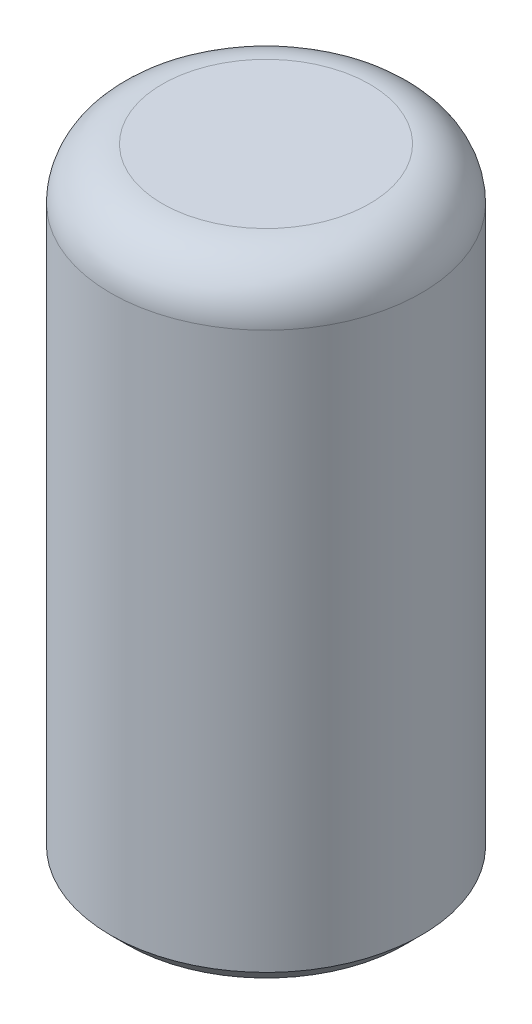
ISO-10303-21;
HEADER;
FILE_DESCRIPTION(('STEP AP214'),'2;1');
FILE_NAME('part.step','',(''),(''),'','','');
FILE_SCHEMA(('AUTOMOTIVE_DESIGN { 1 0 10303 214 1 1 1 1 }'));
ENDSEC;
DATA;
#1=APPLICATION_CONTEXT('core data for automotive mechanical design processes');
#2=APPLICATION_PROTOCOL_DEFINITION('international standard','automotive_design',2000,#1);
#3=PRODUCT_CONTEXT('',#1,'mechanical');
#4=PRODUCT('Part','Part','',(#3));
#5=PRODUCT_RELATED_PRODUCT_CATEGORY('part','',(#4));
#6=PRODUCT_DEFINITION_FORMATION('','',#4);
#7=PRODUCT_DEFINITION_CONTEXT('part definition',#1,'design');
#8=PRODUCT_DEFINITION('design','',#6,#7);
#9=PRODUCT_DEFINITION_SHAPE('','',#8);
#10=(LENGTH_UNIT() NAMED_UNIT(*) SI_UNIT(.MILLI.,.METRE.));
#11=(NAMED_UNIT(*) PLANE_ANGLE_UNIT() SI_UNIT($,.RADIAN.));
#12=(NAMED_UNIT(*) SI_UNIT($,.STERADIAN.) SOLID_ANGLE_UNIT());
#13=UNCERTAINTY_MEASURE_WITH_UNIT(LENGTH_MEASURE(1.E-05),#10,'distance_accuracy_value','');
#14=(GEOMETRIC_REPRESENTATION_CONTEXT(3) GLOBAL_UNCERTAINTY_ASSIGNED_CONTEXT((#13)) GLOBAL_UNIT_ASSIGNED_CONTEXT((#10,
#11,#12)) REPRESENTATION_CONTEXT('',''));
#15=CARTESIAN_POINT('',(0.,0.,0.));
#16=DIRECTION('',(0.,0.,1.));
#17=DIRECTION('',(1.,0.,0.));
#18=AXIS2_PLACEMENT_3D('',#15,#16,#17);
#19=CARTESIAN_POINT('',(0.,0.,0.));
#20=DIRECTION('',(0.,1.,0.));
#21=DIRECTION('',(0.,0.,0.999999999999998));
#22=AXIS2_PLACEMENT_3D('',#19,#20,#21);
#23=PLANE('',#22);
#24=CARTESIAN_POINT('',(0.,0.,0.));
#25=DIRECTION('',(0.,-1.,0.));
#26=DIRECTION('',(0.,0.,-0.999999999999998));
#27=AXIS2_PLACEMENT_3D('',#24,#25,#26);
#28=CIRCLE('',#27,1.13029999999999);
#29=CARTESIAN_POINT('',(0.,0.,-1.13029999999999));
#30=VERTEX_POINT('',#29);
#31=EDGE_CURVE('E76',#30,#30,#28,.T.);
#32=ORIENTED_EDGE('',*,*,#31,.F.);
#33=EDGE_LOOP('',(#32));
#34=FACE_BOUND('',#33,.T.);
#35=CARTESIAN_POINT('',(0.,0.,0.));
#36=DIRECTION('',(0.,1.,0.));
#37=DIRECTION('',(0.,0.,0.999999999999998));
#38=AXIS2_PLACEMENT_3D('',#35,#36,#37);
#39=CIRCLE('',#38,2.11455);
#40=CARTESIAN_POINT('',(0.,0.,2.11455));
#41=VERTEX_POINT('',#40);
#42=EDGE_CURVE('E62',#41,#41,#39,.F.);
#43=ORIENTED_EDGE('',*,*,#42,.T.);
#44=EDGE_LOOP('',(#43));
#45=FACE_BOUND('',#44,.T.);
#46=ADVANCED_FACE('F53',(#34,#45),#23,.F.);
#47=CARTESIAN_POINT('',(0.,0.,0.));
#48=DIRECTION('',(0.,-1.,0.));
#49=DIRECTION('',(0.,0.,-0.999999999999998));
#50=AXIS2_PLACEMENT_3D('',#47,#48,#49);
#51=CYLINDRICAL_SURFACE('',#50,2.36855);
#52=CARTESIAN_POINT('',(0.,0.25399999999999,0.));
#53=DIRECTION('',(0.,1.,0.));
#54=DIRECTION('',(0.,0.,0.999999999999998));
#55=AXIS2_PLACEMENT_3D('',#52,#53,#54);
#56=CIRCLE('',#55,2.36855);
#57=CARTESIAN_POINT('',(0.,0.25399999999999,2.36855));
#58=VERTEX_POINT('',#57);
#59=EDGE_CURVE('E11',#58,#58,#56,.T.);
#60=ORIENTED_EDGE('',*,*,#59,.T.);
#61=EDGE_LOOP('',(#60));
#62=FACE_BOUND('',#61,.T.);
#63=CARTESIAN_POINT('',(0.,8.7376,0.));
#64=DIRECTION('',(0.,-1.,0.));
#65=DIRECTION('',(0.,0.,-0.999999999999998));
#66=AXIS2_PLACEMENT_3D('',#63,#64,#65);
#67=CIRCLE('',#66,2.36855);
#68=CARTESIAN_POINT('',(0.,8.7376,-2.36855000000002));
#69=VERTEX_POINT('',#68);
#70=EDGE_CURVE('E82',#69,#69,#67,.T.);
#71=ORIENTED_EDGE('',*,*,#70,.T.);
#72=EDGE_LOOP('',(#71));
#73=FACE_BOUND('',#72,.T.);
#74=ADVANCED_FACE('F107',(#62,#73),#51,.T.);
#75=CARTESIAN_POINT('',(0.,8.7376,0.));
#76=DIRECTION('',(0.,-1.,0.));
#77=DIRECTION('',(0.,0.,-0.999999999999998));
#78=AXIS2_PLACEMENT_3D('',#75,#76,#77);
#79=TOROIDAL_SURFACE('',#78,1.58115,0.787400000000001);
#80=ORIENTED_EDGE('',*,*,#70,.F.);
#81=EDGE_LOOP('',(#80));
#82=FACE_BOUND('',#81,.T.);
#83=CARTESIAN_POINT('',(0.,9.52499999999999,0.));
#84=DIRECTION('',(0.,-1.,0.));
#85=DIRECTION('',(0.,0.,-0.999999999999998));
#86=AXIS2_PLACEMENT_3D('',#83,#84,#85);
#87=CIRCLE('',#86,1.58115);
#88=CARTESIAN_POINT('',(0.,9.52499999999999,-1.58114999999997));
#89=VERTEX_POINT('',#88);
#90=EDGE_CURVE('E75',#89,#89,#87,.T.);
#91=ORIENTED_EDGE('',*,*,#90,.T.);
#92=EDGE_LOOP('',(#91));
#93=FACE_BOUND('',#92,.T.);
#94=ADVANCED_FACE('F102',(#82,#93),#79,.T.);
#95=CARTESIAN_POINT('',(-1.58115000000003,9.525,0.));
#96=DIRECTION('',(0.,-1.,0.));
#97=DIRECTION('',(0.,0.,-0.999999999999998));
#98=AXIS2_PLACEMENT_3D('',#95,#96,#97);
#99=PLANE('',#98);
#100=ORIENTED_EDGE('',*,*,#90,.F.);
#101=EDGE_LOOP('',(#100));
#102=FACE_BOUND('',#101,.T.);
#103=ADVANCED_FACE('F96',(#102),#99,.F.);
#104=CARTESIAN_POINT('',(0.,0.,0.));
#105=DIRECTION('',(0.,1.,0.));
#106=DIRECTION('',(0.,0.,0.999999999999998));
#107=AXIS2_PLACEMENT_3D('',#104,#105,#106);
#108=CONICAL_SURFACE('',#107,2.11455,0.785398163397448);
#109=ORIENTED_EDGE('',*,*,#59,.F.);
#110=EDGE_LOOP('',(#109));
#111=FACE_BOUND('',#110,.T.);
#112=ORIENTED_EDGE('',*,*,#42,.F.);
#113=EDGE_LOOP('',(#112));
#114=FACE_BOUND('',#113,.T.);
#115=ADVANCED_FACE('F56',(#111,#114),#108,.T.);
#116=CARTESIAN_POINT('',(0.,7.61999999999999,0.));
#117=DIRECTION('',(0.,-1.,0.));
#118=DIRECTION('',(0.,0.,-0.999999999999998));
#119=AXIS2_PLACEMENT_3D('',#116,#117,#118);
#120=CONICAL_SURFACE('',#119,1.1303,1.02974425867665);
#121=CARTESIAN_POINT('',(0.,8.29915275768678,0.));
#122=VERTEX_POINT('',#121);
#123=VERTEX_LOOP('',#122);
#124=FACE_BOUND('',#123,.T.);
#125=CARTESIAN_POINT('',(0.,7.61999999999999,0.));
#126=DIRECTION('',(0.,-1.,0.));
#127=DIRECTION('',(0.,0.,-0.999999999999998));
#128=AXIS2_PLACEMENT_3D('',#125,#126,#127);
#129=CIRCLE('',#128,1.1303);
#130=CARTESIAN_POINT('',(0.,7.61999999999999,-1.1303));
#131=VERTEX_POINT('',#130);
#132=EDGE_CURVE('E72',#131,#131,#129,.T.);
#133=ORIENTED_EDGE('',*,*,#132,.T.);
#134=EDGE_LOOP('',(#133));
#135=FACE_BOUND('',#134,.T.);
#136=ADVANCED_FACE('F65',(#124,#135),#120,.F.);
#137=CARTESIAN_POINT('',(0.,0.,0.));
#138=DIRECTION('',(0.,-1.,0.));
#139=DIRECTION('',(0.,0.,-0.999999999999998));
#140=AXIS2_PLACEMENT_3D('',#137,#138,#139);
#141=CYLINDRICAL_SURFACE('',#140,1.13029999999999);
#142=ORIENTED_EDGE('',*,*,#132,.F.);
#143=EDGE_LOOP('',(#142));
#144=FACE_BOUND('',#143,.T.);
#145=ORIENTED_EDGE('',*,*,#31,.T.);
#146=EDGE_LOOP('',(#145));
#147=FACE_BOUND('',#146,.T.);
#148=ADVANCED_FACE('F68',(#144,#147),#141,.F.);
#149=CLOSED_SHELL('',(#46,#74,#94,#103,#115,#136,#148));
#150=MANIFOLD_SOLID_BREP('B2',#149);
#151=ADVANCED_BREP_SHAPE_REPRESENTATION('',(#18,#150),#14);
#152=SHAPE_DEFINITION_REPRESENTATION(#9,#151);
ENDSEC;
END-ISO-10303-21;
